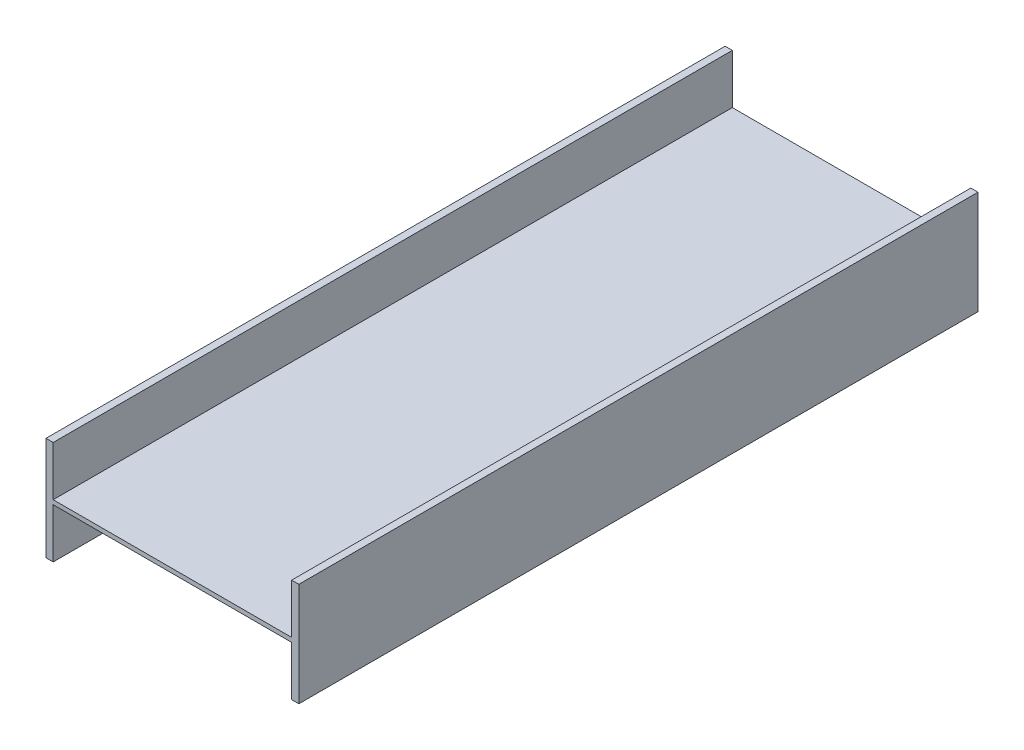
ISO-10303-21;
HEADER;
FILE_DESCRIPTION(('STEP AP214'),'2;1');
FILE_NAME('part.step','',(''),(''),'','','');
FILE_SCHEMA(('AUTOMOTIVE_DESIGN { 1 0 10303 214 1 1 1 1 }'));
ENDSEC;
DATA;
#1=APPLICATION_CONTEXT('core data for automotive mechanical design processes');
#2=APPLICATION_PROTOCOL_DEFINITION('international standard','automotive_design',2000,#1);
#3=PRODUCT_CONTEXT('',#1,'mechanical');
#4=PRODUCT('Part','Part','',(#3));
#5=PRODUCT_RELATED_PRODUCT_CATEGORY('part','',(#4));
#6=PRODUCT_DEFINITION_FORMATION('','',#4);
#7=PRODUCT_DEFINITION_CONTEXT('part definition',#1,'design');
#8=PRODUCT_DEFINITION('design','',#6,#7);
#9=PRODUCT_DEFINITION_SHAPE('','',#8);
#10=(LENGTH_UNIT() NAMED_UNIT(*) SI_UNIT(.MILLI.,.METRE.));
#11=(NAMED_UNIT(*) PLANE_ANGLE_UNIT() SI_UNIT($,.RADIAN.));
#12=(NAMED_UNIT(*) SI_UNIT($,.STERADIAN.) SOLID_ANGLE_UNIT());
#13=UNCERTAINTY_MEASURE_WITH_UNIT(LENGTH_MEASURE(1.E-05),#10,'distance_accuracy_value','');
#14=(GEOMETRIC_REPRESENTATION_CONTEXT(3) GLOBAL_UNCERTAINTY_ASSIGNED_CONTEXT((#13)) GLOBAL_UNIT_ASSIGNED_CONTEXT((#10,
#11,#12)) REPRESENTATION_CONTEXT('',''));
#15=CARTESIAN_POINT('',(0.,0.,0.));
#16=DIRECTION('',(0.,0.,1.));
#17=DIRECTION('',(1.,0.,0.));
#18=AXIS2_PLACEMENT_3D('',#15,#16,#17);
#19=CARTESIAN_POINT('',(0.,-228.6,3000.));
#20=DIRECTION('',(0.,1.,0.));
#21=DIRECTION('',(0.,0.,1.));
#22=AXIS2_PLACEMENT_3D('',#19,#20,#21);
#23=PLANE('',#22);
#24=DIRECTION('',(1.,0.,0.));
#25=VECTOR('',#24,1.);
#26=CARTESIAN_POINT('',(0.,-228.6,0.));
#27=LINE('',#26,#25);
#28=CARTESIAN_POINT('',(-558.5,-228.6,0.));
#29=VERTEX_POINT('',#28);
#30=CARTESIAN_POINT('',(-526.75,-228.6,0.));
#31=VERTEX_POINT('',#30);
#32=EDGE_CURVE('E154',#29,#31,#27,.T.);
#33=ORIENTED_EDGE('',*,*,#32,.T.);
#34=DIRECTION('',(0.,0.,-1.));
#35=VECTOR('',#34,1.);
#36=CARTESIAN_POINT('',(-526.75,-228.6,3000.));
#37=LINE('',#36,#35);
#38=CARTESIAN_POINT('',(-526.75,-228.6,3000.));
#39=VERTEX_POINT('',#38);
#40=EDGE_CURVE('E11',#39,#31,#37,.T.);
#41=ORIENTED_EDGE('',*,*,#40,.F.);
#42=DIRECTION('',(1.,0.,0.));
#43=VECTOR('',#42,1.);
#44=CARTESIAN_POINT('',(0.,-228.6,3000.));
#45=LINE('',#44,#43);
#46=CARTESIAN_POINT('',(-558.5,-228.6,3000.));
#47=VERTEX_POINT('',#46);
#48=EDGE_CURVE('E180',#47,#39,#45,.T.);
#49=ORIENTED_EDGE('',*,*,#48,.F.);
#50=DIRECTION('',(0.,0.,-1.));
#51=VECTOR('',#50,1.);
#52=CARTESIAN_POINT('',(-558.5,-228.6,3000.));
#53=LINE('',#52,#51);
#54=EDGE_CURVE('E49',#47,#29,#53,.T.);
#55=ORIENTED_EDGE('',*,*,#54,.T.);
#56=EDGE_LOOP('',(#33,#41,#49,#55));
#57=FACE_BOUND('',#56,.T.);
#58=ADVANCED_FACE('F33',(#57),#23,.F.);
#59=CARTESIAN_POINT('',(-526.75,0.,3000.));
#60=DIRECTION('',(-1.,0.,0.));
#61=DIRECTION('',(0.,0.,1.));
#62=AXIS2_PLACEMENT_3D('',#59,#60,#61);
#63=PLANE('',#62);
#64=DIRECTION('',(0.,1.,0.));
#65=VECTOR('',#64,1.);
#66=CARTESIAN_POINT('',(-526.75,0.,0.));
#67=LINE('',#66,#65);
#68=CARTESIAN_POINT('',(-526.75,-9.525,0.));
#69=VERTEX_POINT('',#68);
#70=EDGE_CURVE('E156',#31,#69,#67,.T.);
#71=ORIENTED_EDGE('',*,*,#70,.T.);
#72=DIRECTION('',(0.,0.,-1.));
#73=VECTOR('',#72,1.);
#74=CARTESIAN_POINT('',(-526.75,-9.525,3000.));
#75=LINE('',#74,#73);
#76=CARTESIAN_POINT('',(-526.75,-9.525,3000.));
#77=VERTEX_POINT('',#76);
#78=EDGE_CURVE('E41',#77,#69,#75,.T.);
#79=ORIENTED_EDGE('',*,*,#78,.F.);
#80=DIRECTION('',(0.,1.,0.));
#81=VECTOR('',#80,1.);
#82=CARTESIAN_POINT('',(-526.75,0.,3000.));
#83=LINE('',#82,#81);
#84=EDGE_CURVE('E99',#39,#77,#83,.T.);
#85=ORIENTED_EDGE('',*,*,#84,.F.);
#86=ORIENTED_EDGE('',*,*,#40,.T.);
#87=EDGE_LOOP('',(#71,#79,#85,#86));
#88=FACE_BOUND('',#87,.T.);
#89=ADVANCED_FACE('F248',(#88),#63,.F.);
#90=CARTESIAN_POINT('',(0.,-9.525,3000.));
#91=DIRECTION('',(0.,1.,0.));
#92=DIRECTION('',(0.,0.,1.));
#93=AXIS2_PLACEMENT_3D('',#90,#91,#92);
#94=PLANE('',#93);
#95=DIRECTION('',(1.,0.,0.));
#96=VECTOR('',#95,1.);
#97=CARTESIAN_POINT('',(0.,-9.525,0.));
#98=LINE('',#97,#96);
#99=CARTESIAN_POINT('',(526.75,-9.525,0.));
#100=VERTEX_POINT('',#99);
#101=EDGE_CURVE('E158',#69,#100,#98,.T.);
#102=ORIENTED_EDGE('',*,*,#101,.T.);
#103=DIRECTION('',(0.,0.,-1.));
#104=VECTOR('',#103,1.);
#105=CARTESIAN_POINT('',(526.75,-9.525,3000.));
#106=LINE('',#105,#104);
#107=CARTESIAN_POINT('',(526.75,-9.525,3000.));
#108=VERTEX_POINT('',#107);
#109=EDGE_CURVE('E195',#108,#100,#106,.T.);
#110=ORIENTED_EDGE('',*,*,#109,.F.);
#111=DIRECTION('',(1.,0.,0.));
#112=VECTOR('',#111,1.);
#113=CARTESIAN_POINT('',(0.,-9.525,3000.));
#114=LINE('',#113,#112);
#115=EDGE_CURVE('E203',#77,#108,#114,.T.);
#116=ORIENTED_EDGE('',*,*,#115,.F.);
#117=ORIENTED_EDGE('',*,*,#78,.T.);
#118=EDGE_LOOP('',(#102,#110,#116,#117));
#119=FACE_BOUND('',#118,.T.);
#120=ADVANCED_FACE('F201',(#119),#94,.F.);
#121=CARTESIAN_POINT('',(526.75,1.2791119383668E-13,3000.));
#122=DIRECTION('',(1.,0.,0.));
#123=DIRECTION('',(0.,1.,0.));
#124=AXIS2_PLACEMENT_3D('',#121,#122,#123);
#125=PLANE('',#124);
#126=DIRECTION('',(0.,-1.,0.));
#127=VECTOR('',#126,1.);
#128=CARTESIAN_POINT('',(526.75,1.2791119383668E-13,0.));
#129=LINE('',#128,#127);
#130=CARTESIAN_POINT('',(526.75,-228.6,0.));
#131=VERTEX_POINT('',#130);
#132=EDGE_CURVE('E160',#100,#131,#129,.T.);
#133=ORIENTED_EDGE('',*,*,#132,.T.);
#134=DIRECTION('',(0.,0.,-1.));
#135=VECTOR('',#134,1.);
#136=CARTESIAN_POINT('',(526.75,-228.6,3000.));
#137=LINE('',#136,#135);
#138=CARTESIAN_POINT('',(526.75,-228.6,3000.));
#139=VERTEX_POINT('',#138);
#140=EDGE_CURVE('E192',#139,#131,#137,.T.);
#141=ORIENTED_EDGE('',*,*,#140,.F.);
#142=DIRECTION('',(0.,-1.,0.));
#143=VECTOR('',#142,1.);
#144=CARTESIAN_POINT('',(526.75,1.2791119383668E-13,3000.));
#145=LINE('',#144,#143);
#146=EDGE_CURVE('E220',#108,#139,#145,.T.);
#147=ORIENTED_EDGE('',*,*,#146,.F.);
#148=ORIENTED_EDGE('',*,*,#109,.T.);
#149=EDGE_LOOP('',(#133,#141,#147,#148));
#150=FACE_BOUND('',#149,.T.);
#151=ADVANCED_FACE('F210',(#150),#125,.F.);
#152=CARTESIAN_POINT('',(0.,-228.6,3000.));
#153=DIRECTION('',(0.,1.,0.));
#154=DIRECTION('',(0.,0.,1.));
#155=AXIS2_PLACEMENT_3D('',#152,#153,#154);
#156=PLANE('',#155);
#157=DIRECTION('',(1.,0.,0.));
#158=VECTOR('',#157,1.);
#159=CARTESIAN_POINT('',(0.,-228.6,0.));
#160=LINE('',#159,#158);
#161=CARTESIAN_POINT('',(558.5,-228.6,0.));
#162=VERTEX_POINT('',#161);
#163=EDGE_CURVE('E162',#131,#162,#160,.T.);
#164=ORIENTED_EDGE('',*,*,#163,.T.);
#165=DIRECTION('',(0.,0.,-1.));
#166=VECTOR('',#165,1.);
#167=CARTESIAN_POINT('',(558.5,-228.6,3000.));
#168=LINE('',#167,#166);
#169=CARTESIAN_POINT('',(558.5,-228.6,3000.));
#170=VERTEX_POINT('',#169);
#171=EDGE_CURVE('E190',#170,#162,#168,.T.);
#172=ORIENTED_EDGE('',*,*,#171,.F.);
#173=DIRECTION('',(1.,0.,0.));
#174=VECTOR('',#173,1.);
#175=CARTESIAN_POINT('',(0.,-228.6,3000.));
#176=LINE('',#175,#174);
#177=EDGE_CURVE('E216',#139,#170,#176,.T.);
#178=ORIENTED_EDGE('',*,*,#177,.F.);
#179=ORIENTED_EDGE('',*,*,#140,.T.);
#180=EDGE_LOOP('',(#164,#172,#178,#179));
#181=FACE_BOUND('',#180,.T.);
#182=ADVANCED_FACE('F214',(#181),#156,.F.);
#183=CARTESIAN_POINT('',(558.5,1.35621075952133E-13,3000.));
#184=DIRECTION('',(1.,0.,0.));
#185=DIRECTION('',(0.,1.,0.));
#186=AXIS2_PLACEMENT_3D('',#183,#184,#185);
#187=PLANE('',#186);
#188=DIRECTION('',(0.,-1.,0.));
#189=VECTOR('',#188,1.);
#190=CARTESIAN_POINT('',(558.5,1.35621075952133E-13,0.));
#191=LINE('',#190,#189);
#192=CARTESIAN_POINT('',(558.5,228.6,0.));
#193=VERTEX_POINT('',#192);
#194=EDGE_CURVE('E166',#193,#162,#191,.T.);
#195=ORIENTED_EDGE('',*,*,#194,.F.);
#196=DIRECTION('',(0.,0.,-1.));
#197=VECTOR('',#196,1.);
#198=CARTESIAN_POINT('',(558.5,228.6,3000.));
#199=LINE('',#198,#197);
#200=CARTESIAN_POINT('',(558.5,228.6,3000.));
#201=VERTEX_POINT('',#200);
#202=EDGE_CURVE('E188',#201,#193,#199,.T.);
#203=ORIENTED_EDGE('',*,*,#202,.F.);
#204=DIRECTION('',(0.,-1.,0.));
#205=VECTOR('',#204,1.);
#206=CARTESIAN_POINT('',(558.5,1.35621075952133E-13,3000.));
#207=LINE('',#206,#205);
#208=EDGE_CURVE('E219',#201,#170,#207,.T.);
#209=ORIENTED_EDGE('',*,*,#208,.T.);
#210=ORIENTED_EDGE('',*,*,#171,.T.);
#211=EDGE_LOOP('',(#195,#203,#209,#210));
#212=FACE_BOUND('',#211,.T.);
#213=ADVANCED_FACE('F273',(#212),#187,.T.);
#214=CARTESIAN_POINT('',(1.99840144432529E-13,228.600000000001,3000.));
#215=DIRECTION('',(0.,1.,0.));
#216=DIRECTION('',(-1.,0.,0.));
#217=AXIS2_PLACEMENT_3D('',#214,#215,#216);
#218=PLANE('',#217);
#219=DIRECTION('',(1.,0.,0.));
#220=VECTOR('',#219,1.);
#221=CARTESIAN_POINT('',(1.99840144432529E-13,228.600000000001,0.));
#222=LINE('',#221,#220);
#223=CARTESIAN_POINT('',(526.75,228.6,0.));
#224=VERTEX_POINT('',#223);
#225=EDGE_CURVE('E169',#224,#193,#222,.T.);
#226=ORIENTED_EDGE('',*,*,#225,.F.);
#227=DIRECTION('',(0.,0.,-1.));
#228=VECTOR('',#227,1.);
#229=CARTESIAN_POINT('',(526.75,228.6,3000.));
#230=LINE('',#229,#228);
#231=CARTESIAN_POINT('',(526.75,228.6,3000.));
#232=VERTEX_POINT('',#231);
#233=EDGE_CURVE('E186',#232,#224,#230,.T.);
#234=ORIENTED_EDGE('',*,*,#233,.F.);
#235=DIRECTION('',(1.,0.,0.));
#236=VECTOR('',#235,1.);
#237=CARTESIAN_POINT('',(1.99840144432529E-13,228.600000000001,3000.));
#238=LINE('',#237,#236);
#239=EDGE_CURVE('E222',#232,#201,#238,.T.);
#240=ORIENTED_EDGE('',*,*,#239,.T.);
#241=ORIENTED_EDGE('',*,*,#202,.T.);
#242=EDGE_LOOP('',(#226,#234,#240,#241));
#243=FACE_BOUND('',#242,.T.);
#244=ADVANCED_FACE('F267',(#243),#218,.T.);
#245=CARTESIAN_POINT('',(526.75,9.525,0.));
#246=VERTEX_POINT('',#245);
#247=EDGE_CURVE('E163',#224,#246,#129,.T.);
#248=ORIENTED_EDGE('',*,*,#247,.T.);
#249=DIRECTION('',(0.,0.,-1.));
#250=VECTOR('',#249,1.);
#251=CARTESIAN_POINT('',(526.75,9.525,3000.));
#252=LINE('',#251,#250);
#253=CARTESIAN_POINT('',(526.75,9.525,3000.));
#254=VERTEX_POINT('',#253);
#255=EDGE_CURVE('E184',#254,#246,#252,.T.);
#256=ORIENTED_EDGE('',*,*,#255,.F.);
#257=EDGE_CURVE('E225',#232,#254,#145,.T.);
#258=ORIENTED_EDGE('',*,*,#257,.F.);
#259=ORIENTED_EDGE('',*,*,#233,.T.);
#260=EDGE_LOOP('',(#248,#256,#258,#259));
#261=FACE_BOUND('',#260,.T.);
#262=ADVANCED_FACE('F263',(#261),#125,.F.);
#263=CARTESIAN_POINT('',(0.,9.525,3000.));
#264=DIRECTION('',(0.,1.,0.));
#265=DIRECTION('',(0.,0.,1.));
#266=AXIS2_PLACEMENT_3D('',#263,#264,#265);
#267=PLANE('',#266);
#268=DIRECTION('',(1.,0.,0.));
#269=VECTOR('',#268,1.);
#270=CARTESIAN_POINT('',(0.,9.525,0.));
#271=LINE('',#270,#269);
#272=CARTESIAN_POINT('',(-526.75,9.525,0.));
#273=VERTEX_POINT('',#272);
#274=EDGE_CURVE('E172',#273,#246,#271,.T.);
#275=ORIENTED_EDGE('',*,*,#274,.F.);
#276=DIRECTION('',(0.,0.,-1.));
#277=VECTOR('',#276,1.);
#278=CARTESIAN_POINT('',(-526.75,9.525,3000.));
#279=LINE('',#278,#277);
#280=CARTESIAN_POINT('',(-526.75,9.525,3000.));
#281=VERTEX_POINT('',#280);
#282=EDGE_CURVE('E145',#281,#273,#279,.T.);
#283=ORIENTED_EDGE('',*,*,#282,.F.);
#284=DIRECTION('',(1.,0.,0.));
#285=VECTOR('',#284,1.);
#286=CARTESIAN_POINT('',(0.,9.525,3000.));
#287=LINE('',#286,#285);
#288=EDGE_CURVE('E135',#281,#254,#287,.T.);
#289=ORIENTED_EDGE('',*,*,#288,.T.);
#290=ORIENTED_EDGE('',*,*,#255,.T.);
#291=EDGE_LOOP('',(#275,#283,#289,#290));
#292=FACE_BOUND('',#291,.T.);
#293=ADVANCED_FACE('F234',(#292),#267,.T.);
#294=CARTESIAN_POINT('',(-526.75,228.6,0.));
#295=VERTEX_POINT('',#294);
#296=EDGE_CURVE('E142',#273,#295,#67,.T.);
#297=ORIENTED_EDGE('',*,*,#296,.T.);
#298=DIRECTION('',(0.,0.,-1.));
#299=VECTOR('',#298,1.);
#300=CARTESIAN_POINT('',(-526.75,228.6,3000.));
#301=LINE('',#300,#299);
#302=CARTESIAN_POINT('',(-526.75,228.6,3000.));
#303=VERTEX_POINT('',#302);
#304=EDGE_CURVE('E139',#303,#295,#301,.T.);
#305=ORIENTED_EDGE('',*,*,#304,.F.);
#306=EDGE_CURVE('E128',#281,#303,#83,.T.);
#307=ORIENTED_EDGE('',*,*,#306,.F.);
#308=ORIENTED_EDGE('',*,*,#282,.T.);
#309=EDGE_LOOP('',(#297,#305,#307,#308));
#310=FACE_BOUND('',#309,.T.);
#311=ADVANCED_FACE('F140',(#310),#63,.F.);
#312=CARTESIAN_POINT('',(0.,228.6,3000.));
#313=DIRECTION('',(0.,1.,0.));
#314=DIRECTION('',(0.,0.,1.));
#315=AXIS2_PLACEMENT_3D('',#312,#313,#314);
#316=PLANE('',#315);
#317=DIRECTION('',(1.,0.,0.));
#318=VECTOR('',#317,1.);
#319=CARTESIAN_POINT('',(0.,228.6,0.));
#320=LINE('',#319,#318);
#321=CARTESIAN_POINT('',(-558.5,228.6,0.));
#322=VERTEX_POINT('',#321);
#323=EDGE_CURVE('E175',#322,#295,#320,.T.);
#324=ORIENTED_EDGE('',*,*,#323,.F.);
#325=DIRECTION('',(0.,0.,-1.));
#326=VECTOR('',#325,1.);
#327=CARTESIAN_POINT('',(-558.5,228.6,3000.));
#328=LINE('',#327,#326);
#329=CARTESIAN_POINT('',(-558.5,228.6,3000.));
#330=VERTEX_POINT('',#329);
#331=EDGE_CURVE('E87',#330,#322,#328,.T.);
#332=ORIENTED_EDGE('',*,*,#331,.F.);
#333=DIRECTION('',(1.,0.,0.));
#334=VECTOR('',#333,1.);
#335=CARTESIAN_POINT('',(0.,228.6,3000.));
#336=LINE('',#335,#334);
#337=EDGE_CURVE('E133',#330,#303,#336,.T.);
#338=ORIENTED_EDGE('',*,*,#337,.T.);
#339=ORIENTED_EDGE('',*,*,#304,.T.);
#340=EDGE_LOOP('',(#324,#332,#338,#339));
#341=FACE_BOUND('',#340,.T.);
#342=ADVANCED_FACE('F147',(#341),#316,.T.);
#343=CARTESIAN_POINT('',(-558.5,0.,3000.));
#344=DIRECTION('',(-1.,0.,0.));
#345=DIRECTION('',(0.,0.,1.));
#346=AXIS2_PLACEMENT_3D('',#343,#344,#345);
#347=PLANE('',#346);
#348=DIRECTION('',(0.,1.,0.));
#349=VECTOR('',#348,1.);
#350=CARTESIAN_POINT('',(-558.5,0.,0.));
#351=LINE('',#350,#349);
#352=EDGE_CURVE('E177',#29,#322,#351,.T.);
#353=ORIENTED_EDGE('',*,*,#352,.F.);
#354=ORIENTED_EDGE('',*,*,#54,.F.);
#355=DIRECTION('',(0.,1.,0.));
#356=VECTOR('',#355,1.);
#357=CARTESIAN_POINT('',(-558.5,0.,3000.));
#358=LINE('',#357,#356);
#359=EDGE_CURVE('E148',#47,#330,#358,.T.);
#360=ORIENTED_EDGE('',*,*,#359,.T.);
#361=ORIENTED_EDGE('',*,*,#331,.T.);
#362=EDGE_LOOP('',(#353,#354,#360,#361));
#363=FACE_BOUND('',#362,.T.);
#364=ADVANCED_FACE('F237',(#363),#347,.T.);
#365=CARTESIAN_POINT('',(0.,0.,3000.));
#366=DIRECTION('',(0.,0.,1.));
#367=DIRECTION('',(1.,0.,0.));
#368=AXIS2_PLACEMENT_3D('',#365,#366,#367);
#369=PLANE('',#368);
#370=ORIENTED_EDGE('',*,*,#48,.T.);
#371=ORIENTED_EDGE('',*,*,#84,.T.);
#372=ORIENTED_EDGE('',*,*,#115,.T.);
#373=ORIENTED_EDGE('',*,*,#146,.T.);
#374=ORIENTED_EDGE('',*,*,#177,.T.);
#375=ORIENTED_EDGE('',*,*,#208,.F.);
#376=ORIENTED_EDGE('',*,*,#239,.F.);
#377=ORIENTED_EDGE('',*,*,#257,.T.);
#378=ORIENTED_EDGE('',*,*,#288,.F.);
#379=ORIENTED_EDGE('',*,*,#306,.T.);
#380=ORIENTED_EDGE('',*,*,#337,.F.);
#381=ORIENTED_EDGE('',*,*,#359,.F.);
#382=EDGE_LOOP('',(#370,#371,#372,#373,#374,#375,#376,#377,#378,#379,#380,#381));
#383=FACE_BOUND('',#382,.T.);
#384=ADVANCED_FACE('F130',(#383),#369,.T.);
#385=CARTESIAN_POINT('',(0.,0.,0.));
#386=DIRECTION('',(0.,0.,1.));
#387=DIRECTION('',(1.,0.,0.));
#388=AXIS2_PLACEMENT_3D('',#385,#386,#387);
#389=PLANE('',#388);
#390=ORIENTED_EDGE('',*,*,#32,.F.);
#391=ORIENTED_EDGE('',*,*,#352,.T.);
#392=ORIENTED_EDGE('',*,*,#323,.T.);
#393=ORIENTED_EDGE('',*,*,#296,.F.);
#394=ORIENTED_EDGE('',*,*,#274,.T.);
#395=ORIENTED_EDGE('',*,*,#247,.F.);
#396=ORIENTED_EDGE('',*,*,#225,.T.);
#397=ORIENTED_EDGE('',*,*,#194,.T.);
#398=ORIENTED_EDGE('',*,*,#163,.F.);
#399=ORIENTED_EDGE('',*,*,#132,.F.);
#400=ORIENTED_EDGE('',*,*,#101,.F.);
#401=ORIENTED_EDGE('',*,*,#70,.F.);
#402=EDGE_LOOP('',(#390,#391,#392,#393,#394,#395,#396,#397,#398,#399,#400,#401));
#403=FACE_BOUND('',#402,.T.);
#404=ADVANCED_FACE('F206',(#403),#389,.F.);
#405=CLOSED_SHELL('',(#58,#89,#120,#151,#182,#213,#244,#262,#293,#311,#342,#364,#384,#404));
#406=MANIFOLD_SOLID_BREP('B2',#405);
#407=ADVANCED_BREP_SHAPE_REPRESENTATION('',(#18,#406),#14);
#408=SHAPE_DEFINITION_REPRESENTATION(#9,#407);
ENDSEC;
END-ISO-10303-21;
